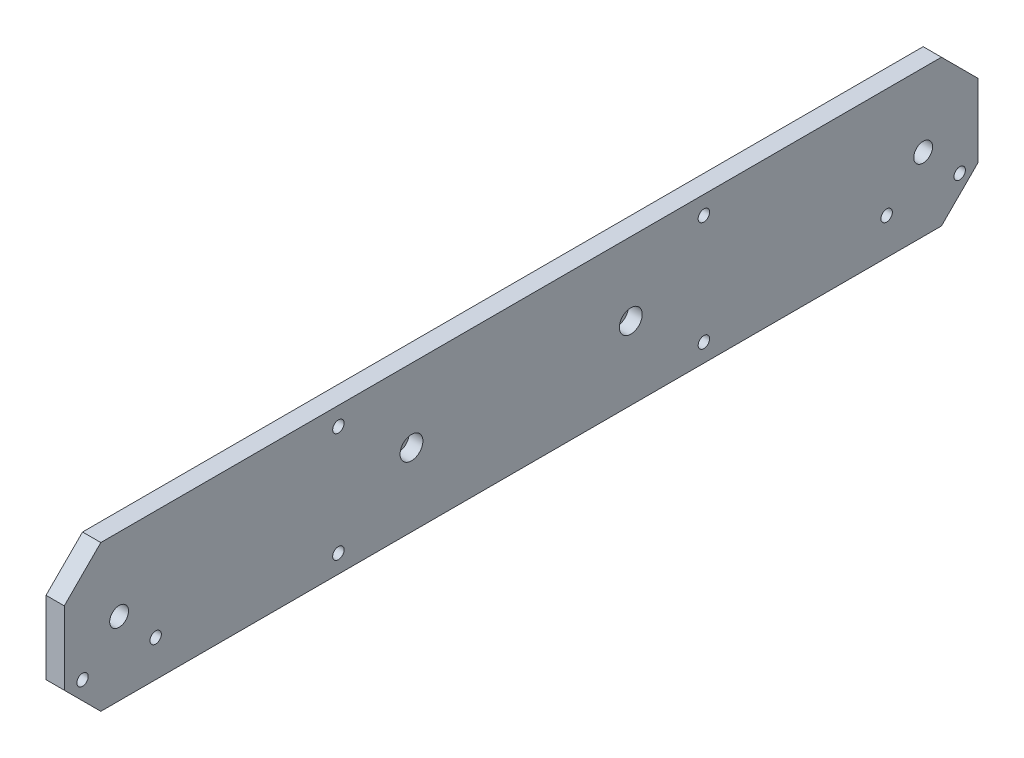
ISO-10303-21;
HEADER;
FILE_DESCRIPTION(('STEP AP214'),'2;1');
FILE_NAME('part.step','',(''),(''),'','','');
FILE_SCHEMA(('AUTOMOTIVE_DESIGN { 1 0 10303 214 1 1 1 1 }'));
ENDSEC;
DATA;
#1=APPLICATION_CONTEXT('core data for automotive mechanical design processes');
#2=APPLICATION_PROTOCOL_DEFINITION('international standard','automotive_design',2000,#1);
#3=PRODUCT_CONTEXT('',#1,'mechanical');
#4=PRODUCT('Part','Part','',(#3));
#5=PRODUCT_RELATED_PRODUCT_CATEGORY('part','',(#4));
#6=PRODUCT_DEFINITION_FORMATION('','',#4);
#7=PRODUCT_DEFINITION_CONTEXT('part definition',#1,'design');
#8=PRODUCT_DEFINITION('design','',#6,#7);
#9=PRODUCT_DEFINITION_SHAPE('','',#8);
#10=(LENGTH_UNIT() NAMED_UNIT(*) SI_UNIT(.MILLI.,.METRE.));
#11=(NAMED_UNIT(*) PLANE_ANGLE_UNIT() SI_UNIT($,.RADIAN.));
#12=(NAMED_UNIT(*) SI_UNIT($,.STERADIAN.) SOLID_ANGLE_UNIT());
#13=UNCERTAINTY_MEASURE_WITH_UNIT(LENGTH_MEASURE(1.E-05),#10,'distance_accuracy_value','');
#14=(GEOMETRIC_REPRESENTATION_CONTEXT(3) GLOBAL_UNCERTAINTY_ASSIGNED_CONTEXT((#13)) GLOBAL_UNIT_ASSIGNED_CONTEXT((#10,
#11,#12)) REPRESENTATION_CONTEXT('',''));
#15=CARTESIAN_POINT('',(0.,0.,0.));
#16=DIRECTION('',(0.,0.,1.));
#17=DIRECTION('',(1.,0.,0.));
#18=AXIS2_PLACEMENT_3D('',#15,#16,#17);
#19=CARTESIAN_POINT('',(12.7,88.9,-444.5));
#20=DIRECTION('',(1.,0.,0.));
#21=DIRECTION('',(0.,0.,-1.));
#22=AXIS2_PLACEMENT_3D('',#19,#20,#21);
#23=CYLINDRICAL_SURFACE('',#22,3.96874999999999);
#24=CARTESIAN_POINT('',(0.,88.9,-444.5));
#25=DIRECTION('',(1.,0.,0.));
#26=DIRECTION('',(0.,0.,-1.));
#27=AXIS2_PLACEMENT_3D('',#24,#25,#26);
#28=CIRCLE('',#27,3.96875);
#29=CARTESIAN_POINT('',(0.,88.9,-448.46875));
#30=VERTEX_POINT('',#29);
#31=EDGE_CURVE('E54',#30,#30,#28,.T.);
#32=ORIENTED_EDGE('',*,*,#31,.F.);
#33=EDGE_LOOP('',(#32));
#34=FACE_BOUND('',#33,.T.);
#35=CARTESIAN_POINT('',(12.7,88.9,-444.5));
#36=DIRECTION('',(1.,0.,0.));
#37=DIRECTION('',(0.,0.,-1.));
#38=AXIS2_PLACEMENT_3D('',#35,#36,#37);
#39=CIRCLE('',#38,3.96874999999999);
#40=CARTESIAN_POINT('',(12.7,88.9,-448.46875));
#41=VERTEX_POINT('',#40);
#42=EDGE_CURVE('E11',#41,#41,#39,.T.);
#43=ORIENTED_EDGE('',*,*,#42,.T.);
#44=EDGE_LOOP('',(#43));
#45=FACE_BOUND('',#44,.T.);
#46=ADVANCED_FACE('F47',(#34,#45),#23,.F.);
#47=CARTESIAN_POINT('',(12.7,88.9,-190.5));
#48=DIRECTION('',(1.,0.,0.));
#49=DIRECTION('',(0.,0.,-1.));
#50=AXIS2_PLACEMENT_3D('',#47,#48,#49);
#51=CYLINDRICAL_SURFACE('',#50,3.96874999999999);
#52=CARTESIAN_POINT('',(0.,88.9,-190.5));
#53=DIRECTION('',(1.,0.,0.));
#54=DIRECTION('',(0.,0.,-1.));
#55=AXIS2_PLACEMENT_3D('',#52,#53,#54);
#56=CIRCLE('',#55,3.96875);
#57=CARTESIAN_POINT('',(0.,88.9,-194.46875));
#58=VERTEX_POINT('',#57);
#59=EDGE_CURVE('E177',#58,#58,#56,.T.);
#60=ORIENTED_EDGE('',*,*,#59,.F.);
#61=EDGE_LOOP('',(#60));
#62=FACE_BOUND('',#61,.T.);
#63=CARTESIAN_POINT('',(12.7,88.9,-190.5));
#64=DIRECTION('',(1.,0.,0.));
#65=DIRECTION('',(0.,0.,-1.));
#66=AXIS2_PLACEMENT_3D('',#63,#64,#65);
#67=CIRCLE('',#66,3.96874999999999);
#68=CARTESIAN_POINT('',(12.7,88.9,-194.46875));
#69=VERTEX_POINT('',#68);
#70=EDGE_CURVE('E180',#69,#69,#67,.T.);
#71=ORIENTED_EDGE('',*,*,#70,.T.);
#72=EDGE_LOOP('',(#71));
#73=FACE_BOUND('',#72,.T.);
#74=ADVANCED_FACE('F188',(#62,#73),#51,.F.);
#75=CARTESIAN_POINT('',(12.7,0.,0.));
#76=DIRECTION('',(0.,0.,-1.));
#77=DIRECTION('',(-1.,0.,0.));
#78=AXIS2_PLACEMENT_3D('',#75,#76,#77);
#79=PLANE('',#78);
#80=DIRECTION('',(0.,-1.,0.));
#81=VECTOR('',#80,1.);
#82=CARTESIAN_POINT('',(0.,0.,0.));
#83=LINE('',#82,#81);
#84=CARTESIAN_POINT('',(0.,76.2,0.));
#85=VERTEX_POINT('',#84);
#86=CARTESIAN_POINT('',(0.,25.4,0.));
#87=VERTEX_POINT('',#86);
#88=EDGE_CURVE('E141',#85,#87,#83,.T.);
#89=ORIENTED_EDGE('',*,*,#88,.T.);
#90=DIRECTION('',(1.,0.,0.));
#91=VECTOR('',#90,1.);
#92=CARTESIAN_POINT('',(12.7,25.4,0.));
#93=LINE('',#92,#91);
#94=CARTESIAN_POINT('',(12.7,25.4,0.));
#95=VERTEX_POINT('',#94);
#96=EDGE_CURVE('E118',#87,#95,#93,.T.);
#97=ORIENTED_EDGE('',*,*,#96,.T.);
#98=DIRECTION('',(0.,-1.,0.));
#99=VECTOR('',#98,1.);
#100=CARTESIAN_POINT('',(12.7,0.,0.));
#101=LINE('',#100,#99);
#102=CARTESIAN_POINT('',(12.7,76.2,0.));
#103=VERTEX_POINT('',#102);
#104=EDGE_CURVE('E151',#103,#95,#101,.T.);
#105=ORIENTED_EDGE('',*,*,#104,.F.);
#106=DIRECTION('',(-1.,0.,0.));
#107=VECTOR('',#106,1.);
#108=CARTESIAN_POINT('',(12.7,76.2,0.));
#109=LINE('',#108,#107);
#110=EDGE_CURVE('E123',#103,#85,#109,.T.);
#111=ORIENTED_EDGE('',*,*,#110,.T.);
#112=EDGE_LOOP('',(#89,#97,#105,#111));
#113=FACE_BOUND('',#112,.T.);
#114=ADVANCED_FACE('F216',(#113),#79,.F.);
#115=CARTESIAN_POINT('',(12.7,0.,0.));
#116=DIRECTION('',(0.,1.,0.));
#117=DIRECTION('',(0.,0.,1.));
#118=AXIS2_PLACEMENT_3D('',#115,#116,#117);
#119=PLANE('',#118);
#120=DIRECTION('',(0.,0.,-1.));
#121=VECTOR('',#120,1.);
#122=CARTESIAN_POINT('',(12.7,0.,0.));
#123=LINE('',#122,#121);
#124=CARTESIAN_POINT('',(12.7,0.,-25.4));
#125=VERTEX_POINT('',#124);
#126=CARTESIAN_POINT('',(12.7,0.,-609.6));
#127=VERTEX_POINT('',#126);
#128=EDGE_CURVE('E133',#125,#127,#123,.T.);
#129=ORIENTED_EDGE('',*,*,#128,.F.);
#130=DIRECTION('',(-1.,0.,0.));
#131=VECTOR('',#130,1.);
#132=CARTESIAN_POINT('',(12.7,0.,-25.4));
#133=LINE('',#132,#131);
#134=CARTESIAN_POINT('',(0.,0.,-25.4));
#135=VERTEX_POINT('',#134);
#136=EDGE_CURVE('E117',#125,#135,#133,.T.);
#137=ORIENTED_EDGE('',*,*,#136,.T.);
#138=DIRECTION('',(0.,0.,-1.));
#139=VECTOR('',#138,1.);
#140=CARTESIAN_POINT('',(0.,0.,0.));
#141=LINE('',#140,#139);
#142=CARTESIAN_POINT('',(0.,0.,-609.6));
#143=VERTEX_POINT('',#142);
#144=EDGE_CURVE('E130',#135,#143,#141,.T.);
#145=ORIENTED_EDGE('',*,*,#144,.T.);
#146=DIRECTION('',(1.,0.,0.));
#147=VECTOR('',#146,1.);
#148=CARTESIAN_POINT('',(12.7,0.,-609.6));
#149=LINE('',#148,#147);
#150=EDGE_CURVE('E135',#143,#127,#149,.T.);
#151=ORIENTED_EDGE('',*,*,#150,.T.);
#152=EDGE_LOOP('',(#129,#137,#145,#151));
#153=FACE_BOUND('',#152,.T.);
#154=ADVANCED_FACE('F129',(#153),#119,.F.);
#155=CARTESIAN_POINT('',(12.7,0.,-635.));
#156=DIRECTION('',(0.,0.,1.));
#157=DIRECTION('',(0.,-1.,0.));
#158=AXIS2_PLACEMENT_3D('',#155,#156,#157);
#159=PLANE('',#158);
#160=DIRECTION('',(0.,1.,0.));
#161=VECTOR('',#160,1.);
#162=CARTESIAN_POINT('',(0.,0.,-635.));
#163=LINE('',#162,#161);
#164=CARTESIAN_POINT('',(0.,25.4,-635.));
#165=VERTEX_POINT('',#164);
#166=CARTESIAN_POINT('',(0.,76.1999999999999,-635.));
#167=VERTEX_POINT('',#166);
#168=EDGE_CURVE('E140',#165,#167,#163,.T.);
#169=ORIENTED_EDGE('',*,*,#168,.T.);
#170=DIRECTION('',(1.,0.,0.));
#171=VECTOR('',#170,1.);
#172=CARTESIAN_POINT('',(12.7,76.1999999999999,-635.));
#173=LINE('',#172,#171);
#174=CARTESIAN_POINT('',(12.7,76.1999999999999,-635.));
#175=VERTEX_POINT('',#174);
#176=EDGE_CURVE('E175',#167,#175,#173,.T.);
#177=ORIENTED_EDGE('',*,*,#176,.T.);
#178=DIRECTION('',(0.,1.,0.));
#179=VECTOR('',#178,1.);
#180=CARTESIAN_POINT('',(12.7,0.,-635.));
#181=LINE('',#180,#179);
#182=CARTESIAN_POINT('',(12.7,25.4,-635.));
#183=VERTEX_POINT('',#182);
#184=EDGE_CURVE('E435',#183,#175,#181,.T.);
#185=ORIENTED_EDGE('',*,*,#184,.F.);
#186=DIRECTION('',(-1.,0.,0.));
#187=VECTOR('',#186,1.);
#188=CARTESIAN_POINT('',(12.7,25.4,-635.));
#189=LINE('',#188,#187);
#190=EDGE_CURVE('E172',#183,#165,#189,.T.);
#191=ORIENTED_EDGE('',*,*,#190,.T.);
#192=EDGE_LOOP('',(#169,#177,#185,#191));
#193=FACE_BOUND('',#192,.T.);
#194=ADVANCED_FACE('F204',(#193),#159,.F.);
#195=CARTESIAN_POINT('',(12.7,101.6,0.));
#196=DIRECTION('',(0.,-1.,0.));
#197=DIRECTION('',(0.,0.,-1.));
#198=AXIS2_PLACEMENT_3D('',#195,#196,#197);
#199=PLANE('',#198);
#200=DIRECTION('',(0.,0.,1.));
#201=VECTOR('',#200,1.);
#202=CARTESIAN_POINT('',(0.,101.6,0.));
#203=LINE('',#202,#201);
#204=CARTESIAN_POINT('',(0.,101.6,-609.6));
#205=VERTEX_POINT('',#204);
#206=CARTESIAN_POINT('',(0.,101.6,-25.4000000000001));
#207=VERTEX_POINT('',#206);
#208=EDGE_CURVE('E144',#205,#207,#203,.T.);
#209=ORIENTED_EDGE('',*,*,#208,.T.);
#210=DIRECTION('',(1.,0.,0.));
#211=VECTOR('',#210,1.);
#212=CARTESIAN_POINT('',(12.7,101.6,-25.4000000000001));
#213=LINE('',#212,#211);
#214=CARTESIAN_POINT('',(12.7,101.6,-25.4000000000001));
#215=VERTEX_POINT('',#214);
#216=EDGE_CURVE('E61',#207,#215,#213,.T.);
#217=ORIENTED_EDGE('',*,*,#216,.T.);
#218=DIRECTION('',(0.,0.,1.));
#219=VECTOR('',#218,1.);
#220=CARTESIAN_POINT('',(12.7,101.6,0.));
#221=LINE('',#220,#219);
#222=CARTESIAN_POINT('',(12.7,101.6,-609.6));
#223=VERTEX_POINT('',#222);
#224=EDGE_CURVE('E152',#223,#215,#221,.T.);
#225=ORIENTED_EDGE('',*,*,#224,.F.);
#226=DIRECTION('',(-1.,0.,0.));
#227=VECTOR('',#226,1.);
#228=CARTESIAN_POINT('',(12.7,101.6,-609.6));
#229=LINE('',#228,#227);
#230=EDGE_CURVE('E168',#223,#205,#229,.T.);
#231=ORIENTED_EDGE('',*,*,#230,.T.);
#232=EDGE_LOOP('',(#209,#217,#225,#231));
#233=FACE_BOUND('',#232,.T.);
#234=ADVANCED_FACE('F193',(#233),#199,.F.);
#235=CARTESIAN_POINT('',(12.7,0.,0.));
#236=DIRECTION('',(-1.,0.,0.));
#237=DIRECTION('',(0.,0.,1.));
#238=AXIS2_PLACEMENT_3D('',#235,#236,#237);
#239=PLANE('',#238);
#240=CARTESIAN_POINT('',(12.7,50.7999999999998,-241.3));
#241=DIRECTION('',(1.,0.,0.));
#242=DIRECTION('',(0.,0.,-1.));
#243=AXIS2_PLACEMENT_3D('',#240,#241,#242);
#244=CIRCLE('',#243,7.9375);
#245=CARTESIAN_POINT('',(12.7,50.7999999999998,-249.2375));
#246=VERTEX_POINT('',#245);
#247=EDGE_CURVE('E503',#246,#246,#244,.T.);
#248=ORIENTED_EDGE('',*,*,#247,.F.);
#249=EDGE_LOOP('',(#248));
#250=FACE_BOUND('',#249,.T.);
#251=CARTESIAN_POINT('',(12.7,50.7999999999998,-393.7));
#252=DIRECTION('',(1.,0.,0.));
#253=DIRECTION('',(0.,0.,-1.));
#254=AXIS2_PLACEMENT_3D('',#251,#252,#253);
#255=CIRCLE('',#254,7.9375);
#256=CARTESIAN_POINT('',(12.7,50.7999999999998,-401.6375));
#257=VERTEX_POINT('',#256);
#258=EDGE_CURVE('E491',#257,#257,#255,.T.);
#259=ORIENTED_EDGE('',*,*,#258,.F.);
#260=EDGE_LOOP('',(#259));
#261=FACE_BOUND('',#260,.T.);
#262=CARTESIAN_POINT('',(12.7,12.7,-444.5));
#263=DIRECTION('',(1.,0.,0.));
#264=DIRECTION('',(0.,0.,-1.));
#265=AXIS2_PLACEMENT_3D('',#262,#263,#264);
#266=CIRCLE('',#265,3.96874999999999);
#267=CARTESIAN_POINT('',(12.7,12.7,-448.46875));
#268=VERTEX_POINT('',#267);
#269=EDGE_CURVE('E476',#268,#268,#266,.T.);
#270=ORIENTED_EDGE('',*,*,#269,.F.);
#271=EDGE_LOOP('',(#270));
#272=FACE_BOUND('',#271,.T.);
#273=CARTESIAN_POINT('',(12.7,12.7,-190.5));
#274=DIRECTION('',(1.,0.,0.));
#275=DIRECTION('',(0.,0.,-1.));
#276=AXIS2_PLACEMENT_3D('',#273,#274,#275);
#277=CIRCLE('',#276,3.96874999999999);
#278=CARTESIAN_POINT('',(12.7,12.7,-194.46875));
#279=VERTEX_POINT('',#278);
#280=EDGE_CURVE('E473',#279,#279,#277,.T.);
#281=ORIENTED_EDGE('',*,*,#280,.F.);
#282=EDGE_LOOP('',(#281));
#283=FACE_BOUND('',#282,.T.);
#284=CARTESIAN_POINT('',(12.7,25.4,-622.3));
#285=DIRECTION('',(-1.,0.,0.));
#286=DIRECTION('',(0.,0.,1.));
#287=AXIS2_PLACEMENT_3D('',#284,#285,#286);
#288=CIRCLE('',#287,3.96875);
#289=CARTESIAN_POINT('',(12.7,25.4,-618.33125));
#290=VERTEX_POINT('',#289);
#291=EDGE_CURVE('E464',#290,#290,#288,.T.);
#292=ORIENTED_EDGE('',*,*,#291,.T.);
#293=EDGE_LOOP('',(#292));
#294=FACE_BOUND('',#293,.T.);
#295=CARTESIAN_POINT('',(12.7,25.4,-571.5));
#296=DIRECTION('',(-1.,0.,0.));
#297=DIRECTION('',(0.,0.,1.));
#298=AXIS2_PLACEMENT_3D('',#295,#296,#297);
#299=CIRCLE('',#298,3.96875);
#300=CARTESIAN_POINT('',(12.7,25.4,-567.53125));
#301=VERTEX_POINT('',#300);
#302=EDGE_CURVE('E458',#301,#301,#299,.T.);
#303=ORIENTED_EDGE('',*,*,#302,.T.);
#304=EDGE_LOOP('',(#303));
#305=FACE_BOUND('',#304,.T.);
#306=CARTESIAN_POINT('',(12.7,25.4,-63.5));
#307=DIRECTION('',(-1.,0.,0.));
#308=DIRECTION('',(0.,0.,1.));
#309=AXIS2_PLACEMENT_3D('',#306,#307,#308);
#310=CIRCLE('',#309,3.96875);
#311=CARTESIAN_POINT('',(12.7,25.4,-59.53125));
#312=VERTEX_POINT('',#311);
#313=EDGE_CURVE('E452',#312,#312,#310,.T.);
#314=ORIENTED_EDGE('',*,*,#313,.T.);
#315=EDGE_LOOP('',(#314));
#316=FACE_BOUND('',#315,.T.);
#317=CARTESIAN_POINT('',(12.7,25.4,-12.7));
#318=DIRECTION('',(-1.,0.,0.));
#319=DIRECTION('',(0.,0.,1.));
#320=AXIS2_PLACEMENT_3D('',#317,#318,#319);
#321=CIRCLE('',#320,3.96875);
#322=CARTESIAN_POINT('',(12.7,25.4,-8.73125000000001));
#323=VERTEX_POINT('',#322);
#324=EDGE_CURVE('E419',#323,#323,#321,.T.);
#325=ORIENTED_EDGE('',*,*,#324,.T.);
#326=EDGE_LOOP('',(#325));
#327=FACE_BOUND('',#326,.T.);
#328=CARTESIAN_POINT('',(12.7,50.8,-38.1));
#329=DIRECTION('',(1.,0.,0.));
#330=DIRECTION('',(0.,0.,-1.));
#331=AXIS2_PLACEMENT_3D('',#328,#329,#330);
#332=CIRCLE('',#331,6.54850099999998);
#333=CARTESIAN_POINT('',(12.7,50.8,-44.648501));
#334=VERTEX_POINT('',#333);
#335=EDGE_CURVE('E417',#334,#334,#332,.T.);
#336=ORIENTED_EDGE('',*,*,#335,.F.);
#337=EDGE_LOOP('',(#336));
#338=FACE_BOUND('',#337,.T.);
#339=CARTESIAN_POINT('',(12.7,50.8,-596.9));
#340=DIRECTION('',(1.,0.,0.));
#341=DIRECTION('',(0.,0.,-1.));
#342=AXIS2_PLACEMENT_3D('',#339,#340,#341);
#343=CIRCLE('',#342,6.54850099999998);
#344=CARTESIAN_POINT('',(12.7,50.8,-603.448501));
#345=VERTEX_POINT('',#344);
#346=EDGE_CURVE('E421',#345,#345,#343,.T.);
#347=ORIENTED_EDGE('',*,*,#346,.F.);
#348=EDGE_LOOP('',(#347));
#349=FACE_BOUND('',#348,.T.);
#350=ORIENTED_EDGE('',*,*,#104,.T.);
#351=DIRECTION('',(0.,0.707106781186548,0.707106781186548));
#352=VECTOR('',#351,1.);
#353=CARTESIAN_POINT('',(12.7,0.,-25.4));
#354=LINE('',#353,#352);
#355=EDGE_CURVE('E166',#95,#125,#354,.F.);
#356=ORIENTED_EDGE('',*,*,#355,.T.);
#357=ORIENTED_EDGE('',*,*,#128,.T.);
#358=DIRECTION('',(0.,-0.707106781186549,0.707106781186546));
#359=VECTOR('',#358,1.);
#360=CARTESIAN_POINT('',(12.7,25.4,-635.));
#361=LINE('',#360,#359);
#362=EDGE_CURVE('E161',#127,#183,#361,.F.);
#363=ORIENTED_EDGE('',*,*,#362,.T.);
#364=ORIENTED_EDGE('',*,*,#184,.T.);
#365=DIRECTION('',(0.,-0.707106781186551,-0.707106781186544));
#366=VECTOR('',#365,1.);
#367=CARTESIAN_POINT('',(12.7,101.6,-609.6));
#368=LINE('',#367,#366);
#369=EDGE_CURVE('E68',#175,#223,#368,.F.);
#370=ORIENTED_EDGE('',*,*,#369,.T.);
#371=ORIENTED_EDGE('',*,*,#224,.T.);
#372=DIRECTION('',(0.,0.707106781186545,-0.70710678118655));
#373=VECTOR('',#372,1.);
#374=CARTESIAN_POINT('',(12.7,76.2,0.));
#375=LINE('',#374,#373);
#376=EDGE_CURVE('E164',#215,#103,#375,.F.);
#377=ORIENTED_EDGE('',*,*,#376,.T.);
#378=EDGE_LOOP('',(#350,#356,#357,#363,#364,#370,#371,#377));
#379=FACE_BOUND('',#378,.T.);
#380=ORIENTED_EDGE('',*,*,#70,.F.);
#381=EDGE_LOOP('',(#380));
#382=FACE_BOUND('',#381,.T.);
#383=ORIENTED_EDGE('',*,*,#42,.F.);
#384=EDGE_LOOP('',(#383));
#385=FACE_BOUND('',#384,.T.);
#386=ADVANCED_FACE('F191',(#250,#261,#272,#283,#294,#305,#316,#327,#338,#349,#379,#382,#385),
#239,.F.);
#387=CARTESIAN_POINT('',(0.,0.,0.));
#388=DIRECTION('',(-1.,0.,0.));
#389=DIRECTION('',(0.,0.,1.));
#390=AXIS2_PLACEMENT_3D('',#387,#388,#389);
#391=PLANE('',#390);
#392=CARTESIAN_POINT('',(0.,50.7999999999998,-241.3));
#393=DIRECTION('',(1.,0.,0.));
#394=DIRECTION('',(0.,0.,-1.));
#395=AXIS2_PLACEMENT_3D('',#392,#393,#394);
#396=CIRCLE('',#395,4.9022);
#397=CARTESIAN_POINT('',(0.,50.7999999999998,-246.2022));
#398=VERTEX_POINT('',#397);
#399=EDGE_CURVE('E494',#398,#398,#396,.T.);
#400=ORIENTED_EDGE('',*,*,#399,.T.);
#401=EDGE_LOOP('',(#400));
#402=FACE_BOUND('',#401,.T.);
#403=CARTESIAN_POINT('',(0.,50.7999999999998,-393.7));
#404=DIRECTION('',(1.,0.,0.));
#405=DIRECTION('',(0.,0.,-1.));
#406=AXIS2_PLACEMENT_3D('',#403,#404,#405);
#407=CIRCLE('',#406,4.9022);
#408=CARTESIAN_POINT('',(0.,50.7999999999998,-398.6022));
#409=VERTEX_POINT('',#408);
#410=EDGE_CURVE('E482',#409,#409,#407,.T.);
#411=ORIENTED_EDGE('',*,*,#410,.T.);
#412=EDGE_LOOP('',(#411));
#413=FACE_BOUND('',#412,.T.);
#414=CARTESIAN_POINT('',(0.,12.7,-444.5));
#415=DIRECTION('',(1.,0.,0.));
#416=DIRECTION('',(0.,0.,-1.));
#417=AXIS2_PLACEMENT_3D('',#414,#415,#416);
#418=CIRCLE('',#417,3.96875);
#419=CARTESIAN_POINT('',(0.,12.7,-448.46875));
#420=VERTEX_POINT('',#419);
#421=EDGE_CURVE('E479',#420,#420,#418,.T.);
#422=ORIENTED_EDGE('',*,*,#421,.T.);
#423=EDGE_LOOP('',(#422));
#424=FACE_BOUND('',#423,.T.);
#425=CARTESIAN_POINT('',(0.,12.7,-190.5));
#426=DIRECTION('',(1.,0.,0.));
#427=DIRECTION('',(0.,0.,-1.));
#428=AXIS2_PLACEMENT_3D('',#425,#426,#427);
#429=CIRCLE('',#428,3.96875);
#430=CARTESIAN_POINT('',(0.,12.7,-194.46875));
#431=VERTEX_POINT('',#430);
#432=EDGE_CURVE('E470',#431,#431,#429,.T.);
#433=ORIENTED_EDGE('',*,*,#432,.T.);
#434=EDGE_LOOP('',(#433));
#435=FACE_BOUND('',#434,.T.);
#436=CARTESIAN_POINT('',(0.,25.4,-622.3));
#437=DIRECTION('',(-1.,0.,0.));
#438=DIRECTION('',(0.,0.,1.));
#439=AXIS2_PLACEMENT_3D('',#436,#437,#438);
#440=CIRCLE('',#439,3.96875);
#441=CARTESIAN_POINT('',(0.,25.4,-618.33125));
#442=VERTEX_POINT('',#441);
#443=EDGE_CURVE('E467',#442,#442,#440,.T.);
#444=ORIENTED_EDGE('',*,*,#443,.F.);
#445=EDGE_LOOP('',(#444));
#446=FACE_BOUND('',#445,.T.);
#447=CARTESIAN_POINT('',(0.,25.4,-571.5));
#448=DIRECTION('',(-1.,0.,0.));
#449=DIRECTION('',(0.,0.,1.));
#450=AXIS2_PLACEMENT_3D('',#447,#448,#449);
#451=CIRCLE('',#450,3.96875);
#452=CARTESIAN_POINT('',(0.,25.4,-567.53125));
#453=VERTEX_POINT('',#452);
#454=EDGE_CURVE('E461',#453,#453,#451,.T.);
#455=ORIENTED_EDGE('',*,*,#454,.F.);
#456=EDGE_LOOP('',(#455));
#457=FACE_BOUND('',#456,.T.);
#458=CARTESIAN_POINT('',(0.,25.4,-63.5));
#459=DIRECTION('',(-1.,0.,0.));
#460=DIRECTION('',(0.,0.,1.));
#461=AXIS2_PLACEMENT_3D('',#458,#459,#460);
#462=CIRCLE('',#461,3.96875);
#463=CARTESIAN_POINT('',(0.,25.4,-59.53125));
#464=VERTEX_POINT('',#463);
#465=EDGE_CURVE('E455',#464,#464,#462,.T.);
#466=ORIENTED_EDGE('',*,*,#465,.F.);
#467=EDGE_LOOP('',(#466));
#468=FACE_BOUND('',#467,.T.);
#469=CARTESIAN_POINT('',(0.,25.4,-12.7));
#470=DIRECTION('',(-1.,0.,0.));
#471=DIRECTION('',(0.,0.,1.));
#472=AXIS2_PLACEMENT_3D('',#469,#470,#471);
#473=CIRCLE('',#472,3.96875);
#474=CARTESIAN_POINT('',(0.,25.4,-8.73125));
#475=VERTEX_POINT('',#474);
#476=EDGE_CURVE('E424',#475,#475,#473,.T.);
#477=ORIENTED_EDGE('',*,*,#476,.F.);
#478=EDGE_LOOP('',(#477));
#479=FACE_BOUND('',#478,.T.);
#480=CARTESIAN_POINT('',(0.,50.8,-38.1));
#481=DIRECTION('',(1.,0.,0.));
#482=DIRECTION('',(0.,0.,-1.));
#483=AXIS2_PLACEMENT_3D('',#480,#481,#482);
#484=CIRCLE('',#483,6.548501);
#485=CARTESIAN_POINT('',(0.,50.8,-44.648501));
#486=VERTEX_POINT('',#485);
#487=EDGE_CURVE('E414',#486,#486,#484,.T.);
#488=ORIENTED_EDGE('',*,*,#487,.T.);
#489=EDGE_LOOP('',(#488));
#490=FACE_BOUND('',#489,.T.);
#491=CARTESIAN_POINT('',(0.,50.8,-596.9));
#492=DIRECTION('',(1.,0.,0.));
#493=DIRECTION('',(0.,0.,-1.));
#494=AXIS2_PLACEMENT_3D('',#491,#492,#493);
#495=CIRCLE('',#494,6.548501);
#496=CARTESIAN_POINT('',(0.,50.8,-603.448501));
#497=VERTEX_POINT('',#496);
#498=EDGE_CURVE('E146',#497,#497,#495,.T.);
#499=ORIENTED_EDGE('',*,*,#498,.T.);
#500=EDGE_LOOP('',(#499));
#501=FACE_BOUND('',#500,.T.);
#502=ORIENTED_EDGE('',*,*,#144,.F.);
#503=DIRECTION('',(0.,-0.707106781186548,-0.707106781186548));
#504=VECTOR('',#503,1.);
#505=CARTESIAN_POINT('',(0.,12.7,-12.7));
#506=LINE('',#505,#504);
#507=EDGE_CURVE('E113',#135,#87,#506,.F.);
#508=ORIENTED_EDGE('',*,*,#507,.T.);
#509=ORIENTED_EDGE('',*,*,#88,.F.);
#510=DIRECTION('',(0.,-0.707106781186545,0.70710678118655));
#511=VECTOR('',#510,1.);
#512=CARTESIAN_POINT('',(0.,38.1000000000003,38.1));
#513=LINE('',#512,#511);
#514=EDGE_CURVE('E124',#85,#207,#513,.F.);
#515=ORIENTED_EDGE('',*,*,#514,.T.);
#516=ORIENTED_EDGE('',*,*,#208,.F.);
#517=DIRECTION('',(0.,0.707106781186551,0.707106781186544));
#518=VECTOR('',#517,1.);
#519=CARTESIAN_POINT('',(0.,355.6,-355.600000000003));
#520=LINE('',#519,#518);
#521=EDGE_CURVE('E155',#205,#167,#520,.F.);
#522=ORIENTED_EDGE('',*,*,#521,.T.);
#523=ORIENTED_EDGE('',*,*,#168,.F.);
#524=DIRECTION('',(0.,0.707106781186549,-0.707106781186546));
#525=VECTOR('',#524,1.);
#526=CARTESIAN_POINT('',(0.,-304.8,-304.800000000001));
#527=LINE('',#526,#525);
#528=EDGE_CURVE('E134',#165,#143,#527,.F.);
#529=ORIENTED_EDGE('',*,*,#528,.T.);
#530=EDGE_LOOP('',(#502,#508,#509,#515,#516,#522,#523,#529));
#531=FACE_BOUND('',#530,.T.);
#532=ORIENTED_EDGE('',*,*,#59,.T.);
#533=EDGE_LOOP('',(#532));
#534=FACE_BOUND('',#533,.T.);
#535=ORIENTED_EDGE('',*,*,#31,.T.);
#536=EDGE_LOOP('',(#535));
#537=FACE_BOUND('',#536,.T.);
#538=ADVANCED_FACE('F137',(#402,#413,#424,#435,#446,#457,#468,#479,#490,#501,#531,#534,#537),
#391,.T.);
#539=CARTESIAN_POINT('',(12.7,50.8,-596.9));
#540=DIRECTION('',(1.,0.,0.));
#541=DIRECTION('',(0.,0.,-1.));
#542=AXIS2_PLACEMENT_3D('',#539,#540,#541);
#543=CYLINDRICAL_SURFACE('',#542,6.54850099999999);
#544=ORIENTED_EDGE('',*,*,#498,.F.);
#545=EDGE_LOOP('',(#544));
#546=FACE_BOUND('',#545,.T.);
#547=ORIENTED_EDGE('',*,*,#346,.T.);
#548=EDGE_LOOP('',(#547));
#549=FACE_BOUND('',#548,.T.);
#550=ADVANCED_FACE('F200',(#546,#549),#543,.F.);
#551=CARTESIAN_POINT('',(12.7,50.8,-38.1));
#552=DIRECTION('',(1.,0.,0.));
#553=DIRECTION('',(0.,0.,-1.));
#554=AXIS2_PLACEMENT_3D('',#551,#552,#553);
#555=CYLINDRICAL_SURFACE('',#554,6.54850099999999);
#556=ORIENTED_EDGE('',*,*,#487,.F.);
#557=EDGE_LOOP('',(#556));
#558=FACE_BOUND('',#557,.T.);
#559=ORIENTED_EDGE('',*,*,#335,.T.);
#560=EDGE_LOOP('',(#559));
#561=FACE_BOUND('',#560,.T.);
#562=ADVANCED_FACE('F223',(#558,#561),#555,.F.);
#563=CARTESIAN_POINT('',(12.7,0.,-25.4));
#564=DIRECTION('',(0.,0.707106781186547,-0.707106781186547));
#565=DIRECTION('',(-1.,0.,0.));
#566=AXIS2_PLACEMENT_3D('',#563,#564,#565);
#567=PLANE('',#566);
#568=ORIENTED_EDGE('',*,*,#355,.F.);
#569=ORIENTED_EDGE('',*,*,#96,.F.);
#570=ORIENTED_EDGE('',*,*,#507,.F.);
#571=ORIENTED_EDGE('',*,*,#136,.F.);
#572=EDGE_LOOP('',(#568,#569,#570,#571));
#573=FACE_BOUND('',#572,.T.);
#574=ADVANCED_FACE('F116',(#573),#567,.F.);
#575=CARTESIAN_POINT('',(12.7,76.2,0.));
#576=DIRECTION('',(0.,-0.70710678118655,-0.707106781186545));
#577=DIRECTION('',(-1.,0.,0.));
#578=AXIS2_PLACEMENT_3D('',#575,#576,#577);
#579=PLANE('',#578);
#580=ORIENTED_EDGE('',*,*,#376,.F.);
#581=ORIENTED_EDGE('',*,*,#216,.F.);
#582=ORIENTED_EDGE('',*,*,#514,.F.);
#583=ORIENTED_EDGE('',*,*,#110,.F.);
#584=EDGE_LOOP('',(#580,#581,#582,#583));
#585=FACE_BOUND('',#584,.T.);
#586=ADVANCED_FACE('F222',(#585),#579,.F.);
#587=CARTESIAN_POINT('',(12.7,101.6,-609.6));
#588=DIRECTION('',(0.,-0.707106781186544,0.707106781186551));
#589=DIRECTION('',(-1.,0.,0.));
#590=AXIS2_PLACEMENT_3D('',#587,#588,#589);
#591=PLANE('',#590);
#592=ORIENTED_EDGE('',*,*,#369,.F.);
#593=ORIENTED_EDGE('',*,*,#176,.F.);
#594=ORIENTED_EDGE('',*,*,#521,.F.);
#595=ORIENTED_EDGE('',*,*,#230,.F.);
#596=EDGE_LOOP('',(#592,#593,#594,#595));
#597=FACE_BOUND('',#596,.T.);
#598=ADVANCED_FACE('F226',(#597),#591,.F.);
#599=CARTESIAN_POINT('',(12.7,25.4,-635.));
#600=DIRECTION('',(0.,0.707106781186546,0.707106781186549));
#601=DIRECTION('',(-1.,0.,0.));
#602=AXIS2_PLACEMENT_3D('',#599,#600,#601);
#603=PLANE('',#602);
#604=ORIENTED_EDGE('',*,*,#362,.F.);
#605=ORIENTED_EDGE('',*,*,#150,.F.);
#606=ORIENTED_EDGE('',*,*,#528,.F.);
#607=ORIENTED_EDGE('',*,*,#190,.F.);
#608=EDGE_LOOP('',(#604,#605,#606,#607));
#609=FACE_BOUND('',#608,.T.);
#610=ADVANCED_FACE('F230',(#609),#603,.F.);
#611=CARTESIAN_POINT('',(0.,25.4,-12.7));
#612=DIRECTION('',(-1.,0.,0.));
#613=DIRECTION('',(0.,0.,1.));
#614=AXIS2_PLACEMENT_3D('',#611,#612,#613);
#615=CYLINDRICAL_SURFACE('',#614,3.96875);
#616=ORIENTED_EDGE('',*,*,#324,.F.);
#617=EDGE_LOOP('',(#616));
#618=FACE_BOUND('',#617,.T.);
#619=ORIENTED_EDGE('',*,*,#476,.T.);
#620=EDGE_LOOP('',(#619));
#621=FACE_BOUND('',#620,.T.);
#622=ADVANCED_FACE('F233',(#618,#621),#615,.F.);
#623=CARTESIAN_POINT('',(0.,25.4,-63.5));
#624=DIRECTION('',(-1.,0.,0.));
#625=DIRECTION('',(0.,0.,1.));
#626=AXIS2_PLACEMENT_3D('',#623,#624,#625);
#627=CYLINDRICAL_SURFACE('',#626,3.96875);
#628=ORIENTED_EDGE('',*,*,#313,.F.);
#629=EDGE_LOOP('',(#628));
#630=FACE_BOUND('',#629,.T.);
#631=ORIENTED_EDGE('',*,*,#465,.T.);
#632=EDGE_LOOP('',(#631));
#633=FACE_BOUND('',#632,.T.);
#634=ADVANCED_FACE('F251',(#630,#633),#627,.F.);
#635=CARTESIAN_POINT('',(0.,25.4,-571.5));
#636=DIRECTION('',(-1.,0.,0.));
#637=DIRECTION('',(0.,0.,1.));
#638=AXIS2_PLACEMENT_3D('',#635,#636,#637);
#639=CYLINDRICAL_SURFACE('',#638,3.96875);
#640=ORIENTED_EDGE('',*,*,#302,.F.);
#641=EDGE_LOOP('',(#640));
#642=FACE_BOUND('',#641,.T.);
#643=ORIENTED_EDGE('',*,*,#454,.T.);
#644=EDGE_LOOP('',(#643));
#645=FACE_BOUND('',#644,.T.);
#646=ADVANCED_FACE('F259',(#642,#645),#639,.F.);
#647=CARTESIAN_POINT('',(0.,25.4,-622.3));
#648=DIRECTION('',(-1.,0.,0.));
#649=DIRECTION('',(0.,0.,1.));
#650=AXIS2_PLACEMENT_3D('',#647,#648,#649);
#651=CYLINDRICAL_SURFACE('',#650,3.96875);
#652=ORIENTED_EDGE('',*,*,#291,.F.);
#653=EDGE_LOOP('',(#652));
#654=FACE_BOUND('',#653,.T.);
#655=ORIENTED_EDGE('',*,*,#443,.T.);
#656=EDGE_LOOP('',(#655));
#657=FACE_BOUND('',#656,.T.);
#658=ADVANCED_FACE('F267',(#654,#657),#651,.F.);
#659=CARTESIAN_POINT('',(12.7,12.7,-190.5));
#660=DIRECTION('',(1.,0.,0.));
#661=DIRECTION('',(0.,0.,-1.));
#662=AXIS2_PLACEMENT_3D('',#659,#660,#661);
#663=CYLINDRICAL_SURFACE('',#662,3.96874999999999);
#664=ORIENTED_EDGE('',*,*,#432,.F.);
#665=EDGE_LOOP('',(#664));
#666=FACE_BOUND('',#665,.T.);
#667=ORIENTED_EDGE('',*,*,#280,.T.);
#668=EDGE_LOOP('',(#667));
#669=FACE_BOUND('',#668,.T.);
#670=ADVANCED_FACE('F275',(#666,#669),#663,.F.);
#671=CARTESIAN_POINT('',(12.7,12.7,-444.5));
#672=DIRECTION('',(1.,0.,0.));
#673=DIRECTION('',(0.,0.,-1.));
#674=AXIS2_PLACEMENT_3D('',#671,#672,#673);
#675=CYLINDRICAL_SURFACE('',#674,3.96874999999999);
#676=ORIENTED_EDGE('',*,*,#421,.F.);
#677=EDGE_LOOP('',(#676));
#678=FACE_BOUND('',#677,.T.);
#679=ORIENTED_EDGE('',*,*,#269,.T.);
#680=EDGE_LOOP('',(#679));
#681=FACE_BOUND('',#680,.T.);
#682=ADVANCED_FACE('F283',(#678,#681),#675,.F.);
#683=CARTESIAN_POINT('',(12.7,50.7999999999998,-393.7));
#684=DIRECTION('',(1.,0.,0.));
#685=DIRECTION('',(0.,0.,-1.));
#686=AXIS2_PLACEMENT_3D('',#683,#684,#685);
#687=CYLINDRICAL_SURFACE('',#686,4.9022);
#688=ORIENTED_EDGE('',*,*,#410,.F.);
#689=EDGE_LOOP('',(#688));
#690=FACE_BOUND('',#689,.T.);
#691=CARTESIAN_POINT('',(3.175,50.7999999999998,-393.7));
#692=DIRECTION('',(1.,0.,0.));
#693=DIRECTION('',(0.,0.,-1.));
#694=AXIS2_PLACEMENT_3D('',#691,#692,#693);
#695=CIRCLE('',#694,4.9022);
#696=CARTESIAN_POINT('',(3.175,50.7999999999998,-398.6022));
#697=VERTEX_POINT('',#696);
#698=EDGE_CURVE('E485',#697,#697,#695,.T.);
#699=ORIENTED_EDGE('',*,*,#698,.T.);
#700=EDGE_LOOP('',(#699));
#701=FACE_BOUND('',#700,.T.);
#702=ADVANCED_FACE('F290',(#690,#701),#687,.F.);
#703=CARTESIAN_POINT('',(3.175,55.7021999999998,-393.7));
#704=DIRECTION('',(-1.,0.,0.));
#705=DIRECTION('',(0.,0.,1.));
#706=AXIS2_PLACEMENT_3D('',#703,#704,#705);
#707=PLANE('',#706);
#708=ORIENTED_EDGE('',*,*,#698,.F.);
#709=EDGE_LOOP('',(#708));
#710=FACE_BOUND('',#709,.T.);
#711=CARTESIAN_POINT('',(3.175,50.7999999999998,-393.7));
#712=DIRECTION('',(1.,0.,0.));
#713=DIRECTION('',(0.,0.,-1.));
#714=AXIS2_PLACEMENT_3D('',#711,#712,#713);
#715=CIRCLE('',#714,7.9375);
#716=CARTESIAN_POINT('',(3.175,50.7999999999998,-401.6375));
#717=VERTEX_POINT('',#716);
#718=EDGE_CURVE('E488',#717,#717,#715,.T.);
#719=ORIENTED_EDGE('',*,*,#718,.T.);
#720=EDGE_LOOP('',(#719));
#721=FACE_BOUND('',#720,.T.);
#722=ADVANCED_FACE('F360',(#710,#721),#707,.F.);
#723=CARTESIAN_POINT('',(12.7,50.7999999999998,-393.7));
#724=DIRECTION('',(1.,0.,0.));
#725=DIRECTION('',(0.,0.,-1.));
#726=AXIS2_PLACEMENT_3D('',#723,#724,#725);
#727=CYLINDRICAL_SURFACE('',#726,7.9375);
#728=ORIENTED_EDGE('',*,*,#718,.F.);
#729=EDGE_LOOP('',(#728));
#730=FACE_BOUND('',#729,.T.);
#731=ORIENTED_EDGE('',*,*,#258,.T.);
#732=EDGE_LOOP('',(#731));
#733=FACE_BOUND('',#732,.T.);
#734=ADVANCED_FACE('F368',(#730,#733),#727,.F.);
#735=CARTESIAN_POINT('',(12.7,50.7999999999998,-241.3));
#736=DIRECTION('',(1.,0.,0.));
#737=DIRECTION('',(0.,0.,-1.));
#738=AXIS2_PLACEMENT_3D('',#735,#736,#737);
#739=CYLINDRICAL_SURFACE('',#738,4.9022);
#740=ORIENTED_EDGE('',*,*,#399,.F.);
#741=EDGE_LOOP('',(#740));
#742=FACE_BOUND('',#741,.T.);
#743=CARTESIAN_POINT('',(3.175,50.7999999999998,-241.3));
#744=DIRECTION('',(1.,0.,0.));
#745=DIRECTION('',(0.,0.,-1.));
#746=AXIS2_PLACEMENT_3D('',#743,#744,#745);
#747=CIRCLE('',#746,4.9022);
#748=CARTESIAN_POINT('',(3.175,50.7999999999998,-246.2022));
#749=VERTEX_POINT('',#748);
#750=EDGE_CURVE('E497',#749,#749,#747,.T.);
#751=ORIENTED_EDGE('',*,*,#750,.T.);
#752=EDGE_LOOP('',(#751));
#753=FACE_BOUND('',#752,.T.);
#754=ADVANCED_FACE('F376',(#742,#753),#739,.F.);
#755=CARTESIAN_POINT('',(3.175,55.7021999999998,-241.3));
#756=DIRECTION('',(-1.,0.,0.));
#757=DIRECTION('',(0.,0.,1.));
#758=AXIS2_PLACEMENT_3D('',#755,#756,#757);
#759=PLANE('',#758);
#760=ORIENTED_EDGE('',*,*,#750,.F.);
#761=EDGE_LOOP('',(#760));
#762=FACE_BOUND('',#761,.T.);
#763=CARTESIAN_POINT('',(3.175,50.7999999999998,-241.3));
#764=DIRECTION('',(1.,0.,0.));
#765=DIRECTION('',(0.,0.,-1.));
#766=AXIS2_PLACEMENT_3D('',#763,#764,#765);
#767=CIRCLE('',#766,7.9375);
#768=CARTESIAN_POINT('',(3.175,50.7999999999998,-249.2375));
#769=VERTEX_POINT('',#768);
#770=EDGE_CURVE('E500',#769,#769,#767,.T.);
#771=ORIENTED_EDGE('',*,*,#770,.T.);
#772=EDGE_LOOP('',(#771));
#773=FACE_BOUND('',#772,.T.);
#774=ADVANCED_FACE('F384',(#762,#773),#759,.F.);
#775=CARTESIAN_POINT('',(12.7,50.7999999999998,-241.3));
#776=DIRECTION('',(1.,0.,0.));
#777=DIRECTION('',(0.,0.,-1.));
#778=AXIS2_PLACEMENT_3D('',#775,#776,#777);
#779=CYLINDRICAL_SURFACE('',#778,7.9375);
#780=ORIENTED_EDGE('',*,*,#770,.F.);
#781=EDGE_LOOP('',(#780));
#782=FACE_BOUND('',#781,.T.);
#783=ORIENTED_EDGE('',*,*,#247,.T.);
#784=EDGE_LOOP('',(#783));
#785=FACE_BOUND('',#784,.T.);
#786=ADVANCED_FACE('F392',(#782,#785),#779,.F.);
#787=CLOSED_SHELL('',(#46,#74,#114,#154,#194,#234,#386,#538,#550,#562,#574,#586,#598,#610,#622,
#634,#646,#658,#670,#682,#702,#722,#734,#754,#774,#786));
#788=MANIFOLD_SOLID_BREP('B2',#787);
#789=ADVANCED_BREP_SHAPE_REPRESENTATION('',(#18,#788),#14);
#790=SHAPE_DEFINITION_REPRESENTATION(#9,#789);
ENDSEC;
END-ISO-10303-21;
